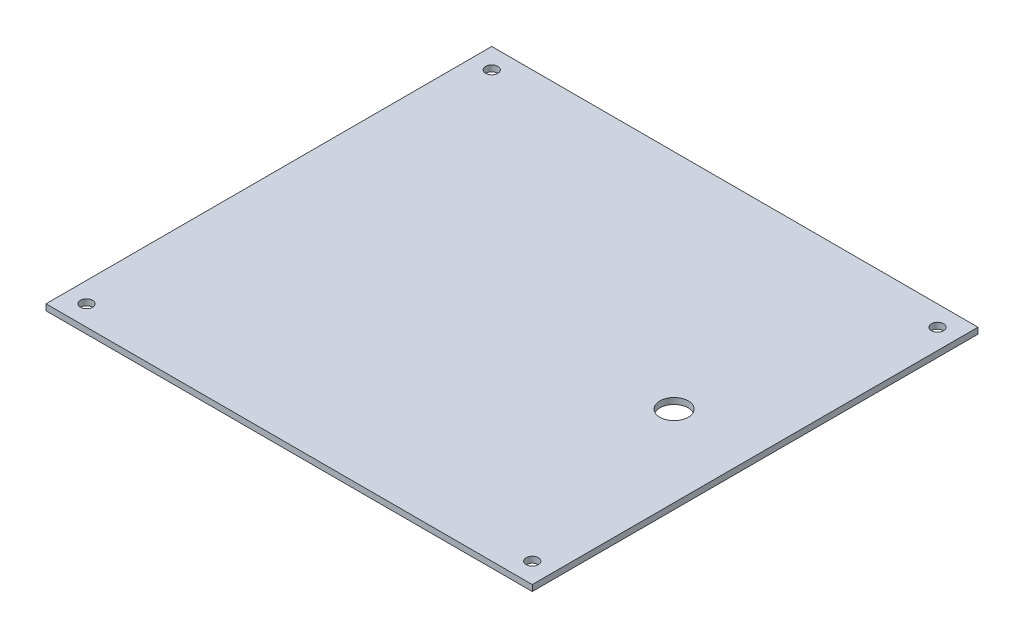
ISO-10303-21;
HEADER;
FILE_DESCRIPTION(('STEP AP214'),'2;1');
FILE_NAME('part.step','',(''),(''),'','','');
FILE_SCHEMA(('AUTOMOTIVE_DESIGN { 1 0 10303 214 1 1 1 1 }'));
ENDSEC;
DATA;
#1=APPLICATION_CONTEXT('core data for automotive mechanical design processes');
#2=APPLICATION_PROTOCOL_DEFINITION('international standard','automotive_design',2000,#1);
#3=PRODUCT_CONTEXT('',#1,'mechanical');
#4=PRODUCT('Part','Part','',(#3));
#5=PRODUCT_RELATED_PRODUCT_CATEGORY('part','',(#4));
#6=PRODUCT_DEFINITION_FORMATION('','',#4);
#7=PRODUCT_DEFINITION_CONTEXT('part definition',#1,'design');
#8=PRODUCT_DEFINITION('design','',#6,#7);
#9=PRODUCT_DEFINITION_SHAPE('','',#8);
#10=(LENGTH_UNIT() NAMED_UNIT(*) SI_UNIT(.MILLI.,.METRE.));
#11=(NAMED_UNIT(*) PLANE_ANGLE_UNIT() SI_UNIT($,.RADIAN.));
#12=(NAMED_UNIT(*) SI_UNIT($,.STERADIAN.) SOLID_ANGLE_UNIT());
#13=UNCERTAINTY_MEASURE_WITH_UNIT(LENGTH_MEASURE(1.E-05),#10,'distance_accuracy_value','');
#14=(GEOMETRIC_REPRESENTATION_CONTEXT(3) GLOBAL_UNCERTAINTY_ASSIGNED_CONTEXT((#13)) GLOBAL_UNIT_ASSIGNED_CONTEXT((#10,
#11,#12)) REPRESENTATION_CONTEXT('',''));
#15=CARTESIAN_POINT('',(0.,0.,0.));
#16=DIRECTION('',(0.,0.,1.));
#17=DIRECTION('',(1.,0.,0.));
#18=AXIS2_PLACEMENT_3D('',#15,#16,#17);
#19=CARTESIAN_POINT('',(0.,1.5,0.));
#20=DIRECTION('',(0.,-1.,0.));
#21=DIRECTION('',(0.,0.,-1.));
#22=AXIS2_PLACEMENT_3D('',#19,#20,#21);
#23=PLANE('',#22);
#24=DIRECTION('',(0.,0.,1.));
#25=VECTOR('',#24,1.);
#26=CARTESIAN_POINT('',(0.,1.5,0.));
#27=LINE('',#26,#25);
#28=CARTESIAN_POINT('',(0.,1.5,-110.));
#29=VERTEX_POINT('',#28);
#30=CARTESIAN_POINT('',(0.,1.5,0.));
#31=VERTEX_POINT('',#30);
#32=EDGE_CURVE('E98',#29,#31,#27,.T.);
#33=ORIENTED_EDGE('',*,*,#32,.T.);
#34=DIRECTION('',(1.,0.,0.));
#35=VECTOR('',#34,1.);
#36=CARTESIAN_POINT('',(0.,1.5,0.));
#37=LINE('',#36,#35);
#38=CARTESIAN_POINT('',(120.,1.5,0.));
#39=VERTEX_POINT('',#38);
#40=EDGE_CURVE('E93',#31,#39,#37,.T.);
#41=ORIENTED_EDGE('',*,*,#40,.T.);
#42=DIRECTION('',(0.,0.,-1.));
#43=VECTOR('',#42,1.);
#44=CARTESIAN_POINT('',(120.,1.5,0.));
#45=LINE('',#44,#43);
#46=CARTESIAN_POINT('',(120.,1.5,-110.));
#47=VERTEX_POINT('',#46);
#48=EDGE_CURVE('E96',#39,#47,#45,.T.);
#49=ORIENTED_EDGE('',*,*,#48,.T.);
#50=DIRECTION('',(-1.,0.,0.));
#51=VECTOR('',#50,1.);
#52=CARTESIAN_POINT('',(0.,1.5,-110.));
#53=LINE('',#52,#51);
#54=EDGE_CURVE('E63',#47,#29,#53,.T.);
#55=ORIENTED_EDGE('',*,*,#54,.T.);
#56=EDGE_LOOP('',(#33,#41,#49,#55));
#57=FACE_BOUND('',#56,.T.);
#58=CARTESIAN_POINT('',(100.,1.5,-55.));
#59=DIRECTION('',(0.,1.,0.));
#60=DIRECTION('',(0.,0.,1.));
#61=AXIS2_PLACEMENT_3D('',#58,#59,#60);
#62=CIRCLE('',#61,3.50000000000001);
#63=CARTESIAN_POINT('',(100.,1.5,-51.5));
#64=VERTEX_POINT('',#63);
#65=EDGE_CURVE('E118',#64,#64,#62,.T.);
#66=ORIENTED_EDGE('',*,*,#65,.F.);
#67=EDGE_LOOP('',(#66));
#68=FACE_BOUND('',#67,.T.);
#69=CARTESIAN_POINT('',(5.,1.5,-105.));
#70=DIRECTION('',(0.,1.,0.));
#71=DIRECTION('',(0.,0.,1.));
#72=AXIS2_PLACEMENT_3D('',#69,#70,#71);
#73=CIRCLE('',#72,1.5);
#74=CARTESIAN_POINT('',(5.,1.5,-103.5));
#75=VERTEX_POINT('',#74);
#76=EDGE_CURVE('E140',#75,#75,#73,.T.);
#77=ORIENTED_EDGE('',*,*,#76,.F.);
#78=EDGE_LOOP('',(#77));
#79=FACE_BOUND('',#78,.T.);
#80=CARTESIAN_POINT('',(115.,1.5,-105.));
#81=DIRECTION('',(0.,1.,0.));
#82=DIRECTION('',(0.,0.,1.));
#83=AXIS2_PLACEMENT_3D('',#80,#81,#82);
#84=CIRCLE('',#83,1.5);
#85=CARTESIAN_POINT('',(115.,1.5,-103.5));
#86=VERTEX_POINT('',#85);
#87=EDGE_CURVE('E148',#86,#86,#84,.T.);
#88=ORIENTED_EDGE('',*,*,#87,.F.);
#89=EDGE_LOOP('',(#88));
#90=FACE_BOUND('',#89,.T.);
#91=CARTESIAN_POINT('',(5.,1.5,-5.));
#92=DIRECTION('',(0.,1.,0.));
#93=DIRECTION('',(0.,0.,1.));
#94=AXIS2_PLACEMENT_3D('',#91,#92,#93);
#95=CIRCLE('',#94,1.5);
#96=CARTESIAN_POINT('',(5.,1.5,-3.5));
#97=VERTEX_POINT('',#96);
#98=EDGE_CURVE('E156',#97,#97,#95,.T.);
#99=ORIENTED_EDGE('',*,*,#98,.F.);
#100=EDGE_LOOP('',(#99));
#101=FACE_BOUND('',#100,.T.);
#102=CARTESIAN_POINT('',(115.,1.5,-5.));
#103=DIRECTION('',(0.,1.,0.));
#104=DIRECTION('',(0.,0.,1.));
#105=AXIS2_PLACEMENT_3D('',#102,#103,#104);
#106=CIRCLE('',#105,1.5);
#107=CARTESIAN_POINT('',(115.,1.5,-3.5));
#108=VERTEX_POINT('',#107);
#109=EDGE_CURVE('E164',#108,#108,#106,.T.);
#110=ORIENTED_EDGE('',*,*,#109,.F.);
#111=EDGE_LOOP('',(#110));
#112=FACE_BOUND('',#111,.T.);
#113=ADVANCED_FACE('F45',(#57,#68,#79,#90,#101,#112),#23,.F.);
#114=CARTESIAN_POINT('',(0.,0.,0.));
#115=DIRECTION('',(0.,-1.,0.));
#116=DIRECTION('',(0.,0.,-1.));
#117=AXIS2_PLACEMENT_3D('',#114,#115,#116);
#118=PLANE('',#117);
#119=CARTESIAN_POINT('',(5.,0.,-5.));
#120=DIRECTION('',(0.,1.,0.));
#121=DIRECTION('',(0.,0.,1.));
#122=AXIS2_PLACEMENT_3D('',#119,#120,#121);
#123=CIRCLE('',#122,1.5);
#124=CARTESIAN_POINT('',(5.,0.,-3.5));
#125=VERTEX_POINT('',#124);
#126=EDGE_CURVE('E160',#125,#125,#123,.T.);
#127=ORIENTED_EDGE('',*,*,#126,.T.);
#128=EDGE_LOOP('',(#127));
#129=FACE_BOUND('',#128,.T.);
#130=CARTESIAN_POINT('',(5.,0.,-105.));
#131=DIRECTION('',(0.,1.,0.));
#132=DIRECTION('',(0.,0.,1.));
#133=AXIS2_PLACEMENT_3D('',#130,#131,#132);
#134=CIRCLE('',#133,1.5);
#135=CARTESIAN_POINT('',(5.,0.,-103.5));
#136=VERTEX_POINT('',#135);
#137=EDGE_CURVE('E144',#136,#136,#134,.T.);
#138=ORIENTED_EDGE('',*,*,#137,.T.);
#139=EDGE_LOOP('',(#138));
#140=FACE_BOUND('',#139,.T.);
#141=DIRECTION('',(0.,0.,1.));
#142=VECTOR('',#141,1.);
#143=CARTESIAN_POINT('',(0.,0.,0.));
#144=LINE('',#143,#142);
#145=CARTESIAN_POINT('',(0.,0.,-110.));
#146=VERTEX_POINT('',#145);
#147=CARTESIAN_POINT('',(0.,0.,0.));
#148=VERTEX_POINT('',#147);
#149=EDGE_CURVE('E114',#146,#148,#144,.T.);
#150=ORIENTED_EDGE('',*,*,#149,.F.);
#151=DIRECTION('',(-1.,0.,0.));
#152=VECTOR('',#151,1.);
#153=CARTESIAN_POINT('',(0.,0.,-110.));
#154=LINE('',#153,#152);
#155=CARTESIAN_POINT('',(120.,0.,-110.));
#156=VERTEX_POINT('',#155);
#157=EDGE_CURVE('E86',#156,#146,#154,.T.);
#158=ORIENTED_EDGE('',*,*,#157,.F.);
#159=DIRECTION('',(0.,0.,-1.));
#160=VECTOR('',#159,1.);
#161=CARTESIAN_POINT('',(120.,0.,0.));
#162=LINE('',#161,#160);
#163=CARTESIAN_POINT('',(120.,0.,0.));
#164=VERTEX_POINT('',#163);
#165=EDGE_CURVE('E80',#164,#156,#162,.T.);
#166=ORIENTED_EDGE('',*,*,#165,.F.);
#167=DIRECTION('',(1.,0.,0.));
#168=VECTOR('',#167,1.);
#169=CARTESIAN_POINT('',(0.,0.,0.));
#170=LINE('',#169,#168);
#171=EDGE_CURVE('E103',#148,#164,#170,.T.);
#172=ORIENTED_EDGE('',*,*,#171,.F.);
#173=EDGE_LOOP('',(#150,#158,#166,#172));
#174=FACE_BOUND('',#173,.T.);
#175=CARTESIAN_POINT('',(100.,0.,-55.));
#176=DIRECTION('',(0.,1.,0.));
#177=DIRECTION('',(0.,0.,1.));
#178=AXIS2_PLACEMENT_3D('',#175,#176,#177);
#179=CIRCLE('',#178,3.50000000000001);
#180=CARTESIAN_POINT('',(100.,0.,-51.5));
#181=VERTEX_POINT('',#180);
#182=EDGE_CURVE('E136',#181,#181,#179,.T.);
#183=ORIENTED_EDGE('',*,*,#182,.T.);
#184=EDGE_LOOP('',(#183));
#185=FACE_BOUND('',#184,.T.);
#186=CARTESIAN_POINT('',(115.,0.,-105.));
#187=DIRECTION('',(0.,1.,0.));
#188=DIRECTION('',(0.,0.,1.));
#189=AXIS2_PLACEMENT_3D('',#186,#187,#188);
#190=CIRCLE('',#189,1.5);
#191=CARTESIAN_POINT('',(115.,0.,-103.5));
#192=VERTEX_POINT('',#191);
#193=EDGE_CURVE('E152',#192,#192,#190,.T.);
#194=ORIENTED_EDGE('',*,*,#193,.T.);
#195=EDGE_LOOP('',(#194));
#196=FACE_BOUND('',#195,.T.);
#197=CARTESIAN_POINT('',(115.,0.,-5.));
#198=DIRECTION('',(0.,1.,0.));
#199=DIRECTION('',(0.,0.,1.));
#200=AXIS2_PLACEMENT_3D('',#197,#198,#199);
#201=CIRCLE('',#200,1.5);
#202=CARTESIAN_POINT('',(115.,0.,-3.5));
#203=VERTEX_POINT('',#202);
#204=EDGE_CURVE('E168',#203,#203,#201,.T.);
#205=ORIENTED_EDGE('',*,*,#204,.T.);
#206=EDGE_LOOP('',(#205));
#207=FACE_BOUND('',#206,.T.);
#208=ADVANCED_FACE('F131',(#129,#140,#174,#185,#196,#207),#118,.T.);
#209=CARTESIAN_POINT('',(0.,1.5,0.));
#210=DIRECTION('',(1.,0.,0.));
#211=DIRECTION('',(0.,0.,-1.));
#212=AXIS2_PLACEMENT_3D('',#209,#210,#211);
#213=PLANE('',#212);
#214=ORIENTED_EDGE('',*,*,#149,.T.);
#215=DIRECTION('',(0.,-1.,0.));
#216=VECTOR('',#215,1.);
#217=CARTESIAN_POINT('',(0.,1.5,0.));
#218=LINE('',#217,#216);
#219=EDGE_CURVE('E11',#31,#148,#218,.T.);
#220=ORIENTED_EDGE('',*,*,#219,.F.);
#221=ORIENTED_EDGE('',*,*,#32,.F.);
#222=DIRECTION('',(0.,-1.,0.));
#223=VECTOR('',#222,1.);
#224=CARTESIAN_POINT('',(0.,1.5,-110.));
#225=LINE('',#224,#223);
#226=EDGE_CURVE('E110',#29,#146,#225,.T.);
#227=ORIENTED_EDGE('',*,*,#226,.T.);
#228=EDGE_LOOP('',(#214,#220,#221,#227));
#229=FACE_BOUND('',#228,.T.);
#230=ADVANCED_FACE('F47',(#229),#213,.F.);
#231=CARTESIAN_POINT('',(0.,1.5,0.));
#232=DIRECTION('',(0.,0.,-1.));
#233=DIRECTION('',(-1.,0.,0.));
#234=AXIS2_PLACEMENT_3D('',#231,#232,#233);
#235=PLANE('',#234);
#236=ORIENTED_EDGE('',*,*,#171,.T.);
#237=DIRECTION('',(0.,-1.,0.));
#238=VECTOR('',#237,1.);
#239=CARTESIAN_POINT('',(120.,1.5,0.));
#240=LINE('',#239,#238);
#241=EDGE_CURVE('E55',#39,#164,#240,.T.);
#242=ORIENTED_EDGE('',*,*,#241,.F.);
#243=ORIENTED_EDGE('',*,*,#40,.F.);
#244=ORIENTED_EDGE('',*,*,#219,.T.);
#245=EDGE_LOOP('',(#236,#242,#243,#244));
#246=FACE_BOUND('',#245,.T.);
#247=ADVANCED_FACE('F102',(#246),#235,.F.);
#248=CARTESIAN_POINT('',(120.,1.5,0.));
#249=DIRECTION('',(-1.,0.,0.));
#250=DIRECTION('',(0.,0.,1.));
#251=AXIS2_PLACEMENT_3D('',#248,#249,#250);
#252=PLANE('',#251);
#253=ORIENTED_EDGE('',*,*,#165,.T.);
#254=DIRECTION('',(0.,-1.,0.));
#255=VECTOR('',#254,1.);
#256=CARTESIAN_POINT('',(120.,1.5,-110.));
#257=LINE('',#256,#255);
#258=EDGE_CURVE('E105',#47,#156,#257,.T.);
#259=ORIENTED_EDGE('',*,*,#258,.F.);
#260=ORIENTED_EDGE('',*,*,#48,.F.);
#261=ORIENTED_EDGE('',*,*,#241,.T.);
#262=EDGE_LOOP('',(#253,#259,#260,#261));
#263=FACE_BOUND('',#262,.T.);
#264=ADVANCED_FACE('F106',(#263),#252,.F.);
#265=CARTESIAN_POINT('',(0.,1.5,-110.));
#266=DIRECTION('',(0.,0.,1.));
#267=DIRECTION('',(1.,0.,0.));
#268=AXIS2_PLACEMENT_3D('',#265,#266,#267);
#269=PLANE('',#268);
#270=ORIENTED_EDGE('',*,*,#157,.T.);
#271=ORIENTED_EDGE('',*,*,#226,.F.);
#272=ORIENTED_EDGE('',*,*,#54,.F.);
#273=ORIENTED_EDGE('',*,*,#258,.T.);
#274=EDGE_LOOP('',(#270,#271,#272,#273));
#275=FACE_BOUND('',#274,.T.);
#276=ADVANCED_FACE('F128',(#275),#269,.F.);
#277=CARTESIAN_POINT('',(100.,1.5,-55.));
#278=DIRECTION('',(0.,-1.,0.));
#279=DIRECTION('',(0.,0.,-1.));
#280=AXIS2_PLACEMENT_3D('',#277,#278,#279);
#281=CYLINDRICAL_SURFACE('',#280,3.50000000000001);
#282=ORIENTED_EDGE('',*,*,#65,.T.);
#283=EDGE_LOOP('',(#282));
#284=FACE_BOUND('',#283,.T.);
#285=ORIENTED_EDGE('',*,*,#182,.F.);
#286=EDGE_LOOP('',(#285));
#287=FACE_BOUND('',#286,.T.);
#288=ADVANCED_FACE('F187',(#284,#287),#281,.F.);
#289=CARTESIAN_POINT('',(5.,1.5,-105.));
#290=DIRECTION('',(0.,-1.,0.));
#291=DIRECTION('',(0.,0.,-1.));
#292=AXIS2_PLACEMENT_3D('',#289,#290,#291);
#293=CYLINDRICAL_SURFACE('',#292,1.5);
#294=ORIENTED_EDGE('',*,*,#76,.T.);
#295=EDGE_LOOP('',(#294));
#296=FACE_BOUND('',#295,.T.);
#297=ORIENTED_EDGE('',*,*,#137,.F.);
#298=EDGE_LOOP('',(#297));
#299=FACE_BOUND('',#298,.T.);
#300=ADVANCED_FACE('F232',(#296,#299),#293,.F.);
#301=CARTESIAN_POINT('',(115.,1.5,-105.));
#302=DIRECTION('',(0.,-1.,0.));
#303=DIRECTION('',(0.,0.,-1.));
#304=AXIS2_PLACEMENT_3D('',#301,#302,#303);
#305=CYLINDRICAL_SURFACE('',#304,1.5);
#306=ORIENTED_EDGE('',*,*,#87,.T.);
#307=EDGE_LOOP('',(#306));
#308=FACE_BOUND('',#307,.T.);
#309=ORIENTED_EDGE('',*,*,#193,.F.);
#310=EDGE_LOOP('',(#309));
#311=FACE_BOUND('',#310,.T.);
#312=ADVANCED_FACE('F240',(#308,#311),#305,.F.);
#313=CARTESIAN_POINT('',(5.,1.5,-5.));
#314=DIRECTION('',(0.,-1.,0.));
#315=DIRECTION('',(0.,0.,-1.));
#316=AXIS2_PLACEMENT_3D('',#313,#314,#315);
#317=CYLINDRICAL_SURFACE('',#316,1.5);
#318=ORIENTED_EDGE('',*,*,#98,.T.);
#319=EDGE_LOOP('',(#318));
#320=FACE_BOUND('',#319,.T.);
#321=ORIENTED_EDGE('',*,*,#126,.F.);
#322=EDGE_LOOP('',(#321));
#323=FACE_BOUND('',#322,.T.);
#324=ADVANCED_FACE('F248',(#320,#323),#317,.F.);
#325=CARTESIAN_POINT('',(115.,1.5,-5.));
#326=DIRECTION('',(0.,-1.,0.));
#327=DIRECTION('',(0.,0.,-1.));
#328=AXIS2_PLACEMENT_3D('',#325,#326,#327);
#329=CYLINDRICAL_SURFACE('',#328,1.5);
#330=ORIENTED_EDGE('',*,*,#109,.T.);
#331=EDGE_LOOP('',(#330));
#332=FACE_BOUND('',#331,.T.);
#333=ORIENTED_EDGE('',*,*,#204,.F.);
#334=EDGE_LOOP('',(#333));
#335=FACE_BOUND('',#334,.T.);
#336=ADVANCED_FACE('F176',(#332,#335),#329,.F.);
#337=CLOSED_SHELL('',(#113,#208,#230,#247,#264,#276,#288,#300,#312,#324,#336));
#338=MANIFOLD_SOLID_BREP('B2',#337);
#339=ADVANCED_BREP_SHAPE_REPRESENTATION('',(#18,#338),#14);
#340=SHAPE_DEFINITION_REPRESENTATION(#9,#339);
ENDSEC;
END-ISO-10303-21;
